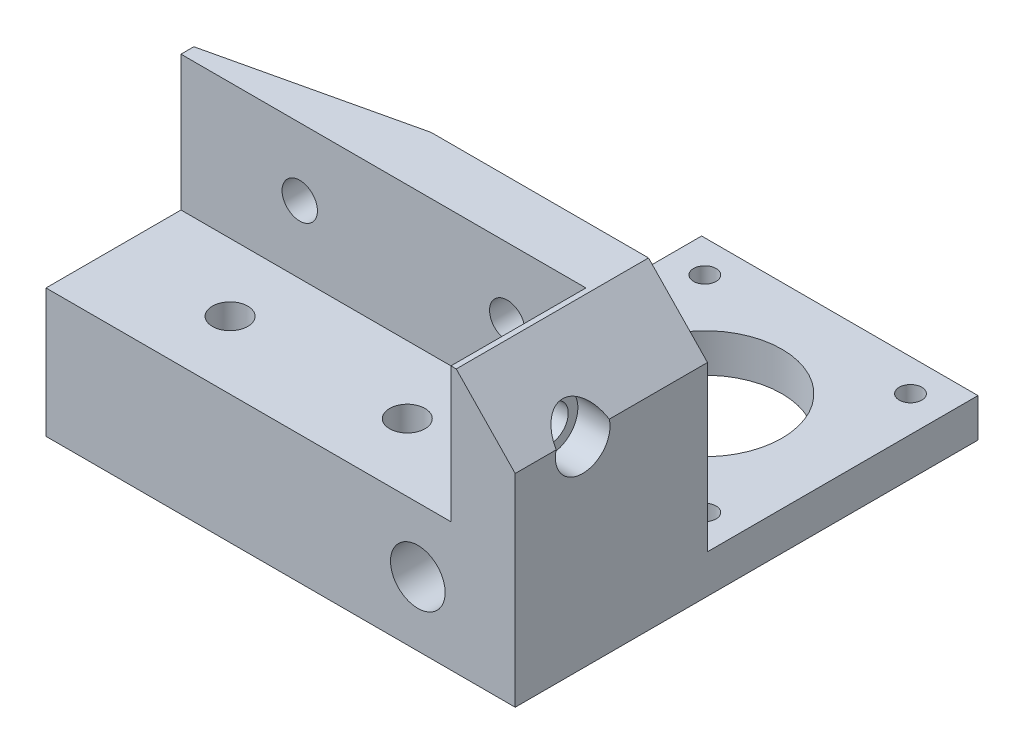
ISO-10303-21;
HEADER;
FILE_DESCRIPTION(('STEP AP214'),'2;1');
FILE_NAME('part.step','',(''),(''),'','','');
FILE_SCHEMA(('AUTOMOTIVE_DESIGN { 1 0 10303 214 1 1 1 1 }'));
ENDSEC;
DATA;
#1=APPLICATION_CONTEXT('core data for automotive mechanical design processes');
#2=APPLICATION_PROTOCOL_DEFINITION('international standard','automotive_design',2000,#1);
#3=PRODUCT_CONTEXT('',#1,'mechanical');
#4=PRODUCT('Part','Part','',(#3));
#5=PRODUCT_RELATED_PRODUCT_CATEGORY('part','',(#4));
#6=PRODUCT_DEFINITION_FORMATION('','',#4);
#7=PRODUCT_DEFINITION_CONTEXT('part definition',#1,'design');
#8=PRODUCT_DEFINITION('design','',#6,#7);
#9=PRODUCT_DEFINITION_SHAPE('','',#8);
#10=(LENGTH_UNIT() NAMED_UNIT(*) SI_UNIT(.MILLI.,.METRE.));
#11=(NAMED_UNIT(*) PLANE_ANGLE_UNIT() SI_UNIT($,.RADIAN.));
#12=(NAMED_UNIT(*) SI_UNIT($,.STERADIAN.) SOLID_ANGLE_UNIT());
#13=UNCERTAINTY_MEASURE_WITH_UNIT(LENGTH_MEASURE(1.E-05),#10,'distance_accuracy_value','');
#14=(GEOMETRIC_REPRESENTATION_CONTEXT(3) GLOBAL_UNCERTAINTY_ASSIGNED_CONTEXT((#13)) GLOBAL_UNIT_ASSIGNED_CONTEXT((#10,
#11,#12)) REPRESENTATION_CONTEXT('',''));
#15=CARTESIAN_POINT('',(0.,0.,0.));
#16=DIRECTION('',(0.,0.,1.));
#17=DIRECTION('',(1.,0.,0.));
#18=AXIS2_PLACEMENT_3D('',#15,#16,#17);
#19=CARTESIAN_POINT('',(106.971365542953,0.,32.5250375640439));
#20=DIRECTION('',(0.,1.,0.));
#21=DIRECTION('',(0.,0.,1.));
#22=AXIS2_PLACEMENT_3D('',#19,#20,#21);
#23=CYLINDRICAL_SURFACE('',#22,2.75);
#24=CARTESIAN_POINT('',(106.971365542953,20.,32.5250375640439));
#25=DIRECTION('',(0.,-1.,0.));
#26=DIRECTION('',(0.,0.,1.));
#27=AXIS2_PLACEMENT_3D('',#24,#25,#26);
#28=CIRCLE('',#27,2.75);
#29=CARTESIAN_POINT('',(106.971365542953,20.,35.2750375640439));
#30=VERTEX_POINT('',#29);
#31=EDGE_CURVE('E225',#30,#30,#28,.T.);
#32=ORIENTED_EDGE('',*,*,#31,.F.);
#33=EDGE_LOOP('',(#32));
#34=FACE_BOUND('',#33,.T.);
#35=CARTESIAN_POINT('',(106.971365542953,15.5,32.5250375640439));
#36=DIRECTION('',(0.,1.,0.));
#37=DIRECTION('',(0.,0.,-1.));
#38=AXIS2_PLACEMENT_3D('',#35,#36,#37);
#39=CIRCLE('',#38,2.75);
#40=CARTESIAN_POINT('',(106.971365542953,15.5,29.7750375640439));
#41=VERTEX_POINT('',#40);
#42=EDGE_CURVE('E37',#41,#41,#39,.F.);
#43=ORIENTED_EDGE('',*,*,#42,.T.);
#44=EDGE_LOOP('',(#43));
#45=FACE_BOUND('',#44,.T.);
#46=ADVANCED_FACE('F33',(#34,#45),#23,.F.);
#47=CARTESIAN_POINT('',(79.3993980804299,0.,32.5250375640439));
#48=DIRECTION('',(0.,1.,0.));
#49=DIRECTION('',(0.,0.,1.));
#50=AXIS2_PLACEMENT_3D('',#47,#48,#49);
#51=CYLINDRICAL_SURFACE('',#50,2.75);
#52=CARTESIAN_POINT('',(79.3993980804299,20.,32.5250375640439));
#53=DIRECTION('',(0.,-1.,0.));
#54=DIRECTION('',(0.,0.,1.));
#55=AXIS2_PLACEMENT_3D('',#52,#53,#54);
#56=CIRCLE('',#55,2.75);
#57=CARTESIAN_POINT('',(79.3993980804299,20.,35.2750375640439));
#58=VERTEX_POINT('',#57);
#59=EDGE_CURVE('E220',#58,#58,#56,.T.);
#60=ORIENTED_EDGE('',*,*,#59,.F.);
#61=EDGE_LOOP('',(#60));
#62=FACE_BOUND('',#61,.T.);
#63=CARTESIAN_POINT('',(79.3993980804299,15.5,32.5250375640439));
#64=DIRECTION('',(0.,1.,0.));
#65=DIRECTION('',(0.,0.,-1.));
#66=AXIS2_PLACEMENT_3D('',#63,#64,#65);
#67=CIRCLE('',#66,2.75);
#68=CARTESIAN_POINT('',(79.3993980804299,15.5,29.7750375640439));
#69=VERTEX_POINT('',#68);
#70=EDGE_CURVE('E218',#69,#69,#67,.F.);
#71=ORIENTED_EDGE('',*,*,#70,.T.);
#72=EDGE_LOOP('',(#71));
#73=FACE_BOUND('',#72,.T.);
#74=ADVANCED_FACE('F267',(#62,#73),#51,.F.);
#75=CARTESIAN_POINT('',(134.262900047815,6.,-28.9749624359561));
#76=DIRECTION('',(-1.,0.,0.));
#77=DIRECTION('',(0.,0.,-1.));
#78=AXIS2_PLACEMENT_3D('',#75,#76,#77);
#79=PLANE('',#78);
#80=CARTESIAN_POINT('',(134.262900047816,30.5,32.5250375640439));
#81=DIRECTION('',(1.,0.,0.));
#82=DIRECTION('',(0.,0.,-1.));
#83=AXIS2_PLACEMENT_3D('',#80,#81,#82);
#84=CIRCLE('',#83,4.25);
#85=CARTESIAN_POINT('',(134.262900047815,31.5,36.6557154745085));
#86=VERTEX_POINT('',#85);
#87=CARTESIAN_POINT('',(134.262900047816,31.4999999999999,28.3943596535793));
#88=VERTEX_POINT('',#87);
#89=EDGE_CURVE('E131',#86,#88,#84,.T.);
#90=ORIENTED_EDGE('',*,*,#89,.F.);
#91=DIRECTION('',(0.,0.,-1.));
#92=VECTOR('',#91,1.);
#93=CARTESIAN_POINT('',(134.262900047815,31.5,13.1094021442886));
#94=LINE('',#93,#92);
#95=CARTESIAN_POINT('',(134.262900047815,31.5,43.0250375640439));
#96=VERTEX_POINT('',#95);
#97=EDGE_CURVE('E127',#96,#86,#94,.T.);
#98=ORIENTED_EDGE('',*,*,#97,.F.);
#99=DIRECTION('',(0.,-1.,0.));
#100=VECTOR('',#99,1.);
#101=CARTESIAN_POINT('',(134.262900047815,6.,43.0250375640439));
#102=LINE('',#101,#100);
#103=CARTESIAN_POINT('',(134.262900047815,0.,43.0250375640439));
#104=VERTEX_POINT('',#103);
#105=EDGE_CURVE('E326',#96,#104,#102,.T.);
#106=ORIENTED_EDGE('',*,*,#105,.T.);
#107=DIRECTION('',(0.,0.,1.));
#108=VECTOR('',#107,1.);
#109=CARTESIAN_POINT('',(134.262900047815,0.,-28.9749624359561));
#110=LINE('',#109,#108);
#111=CARTESIAN_POINT('',(134.262900047815,0.,-28.9749624359561));
#112=VERTEX_POINT('',#111);
#113=EDGE_CURVE('E343',#112,#104,#110,.T.);
#114=ORIENTED_EDGE('',*,*,#113,.F.);
#115=DIRECTION('',(0.,-1.,0.));
#116=VECTOR('',#115,1.);
#117=CARTESIAN_POINT('',(134.262900047815,6.,-28.9749624359561));
#118=LINE('',#117,#116);
#119=CARTESIAN_POINT('',(134.262900047815,6.,-28.9749624359561));
#120=VERTEX_POINT('',#119);
#121=EDGE_CURVE('E366',#120,#112,#118,.T.);
#122=ORIENTED_EDGE('',*,*,#121,.F.);
#123=DIRECTION('',(0.,0.,1.));
#124=VECTOR('',#123,1.);
#125=CARTESIAN_POINT('',(134.262900047815,6.,-28.9749624359561));
#126=LINE('',#125,#124);
#127=CARTESIAN_POINT('',(134.262900047815,6.,13.1094021442886));
#128=VERTEX_POINT('',#127);
#129=EDGE_CURVE('E192',#120,#128,#126,.T.);
#130=ORIENTED_EDGE('',*,*,#129,.T.);
#131=DIRECTION('',(0.,-1.,0.));
#132=VECTOR('',#131,1.);
#133=CARTESIAN_POINT('',(134.262900047815,41.,13.1094021442886));
#134=LINE('',#133,#132);
#135=CARTESIAN_POINT('',(134.262900047815,31.5,13.1094021442886));
#136=VERTEX_POINT('',#135);
#137=EDGE_CURVE('E133',#136,#128,#134,.T.);
#138=ORIENTED_EDGE('',*,*,#137,.F.);
#139=DIRECTION('',(0.,0.,-1.));
#140=VECTOR('',#139,1.);
#141=CARTESIAN_POINT('',(134.262900047815,31.5,13.1094021442886));
#142=LINE('',#141,#140);
#143=EDGE_CURVE('E124',#88,#136,#142,.T.);
#144=ORIENTED_EDGE('',*,*,#143,.F.);
#145=EDGE_LOOP('',(#90,#98,#106,#114,#122,#130,#138,#144));
#146=FACE_BOUND('',#145,.T.);
#147=ADVANCED_FACE('F130',(#146),#79,.F.);
#148=CARTESIAN_POINT('',(125.088856687148,41.,0.));
#149=DIRECTION('',(0.719339800338652,0.694658370458996,0.));
#150=DIRECTION('',(0.,0.,-1.));
#151=AXIS2_PLACEMENT_3D('',#148,#149,#150);
#152=PLANE('',#151);
#153=ORIENTED_EDGE('',*,*,#143,.T.);
#154=DIRECTION('',(-0.694658370458996,0.719339800338652,0.));
#155=VECTOR('',#154,1.);
#156=CARTESIAN_POINT('',(125.088856687148,41.,13.1094021442886));
#157=LINE('',#156,#155);
#158=CARTESIAN_POINT('',(125.088856687148,41.,13.1094021442886));
#159=VERTEX_POINT('',#158);
#160=EDGE_CURVE('E42',#136,#159,#157,.T.);
#161=ORIENTED_EDGE('',*,*,#160,.T.);
#162=DIRECTION('',(0.,0.,1.));
#163=VECTOR('',#162,1.);
#164=CARTESIAN_POINT('',(125.088856687148,41.,43.0250375640439));
#165=LINE('',#164,#163);
#166=CARTESIAN_POINT('',(125.088856687148,41.,43.0250375640439));
#167=VERTEX_POINT('',#166);
#168=EDGE_CURVE('E197',#159,#167,#165,.T.);
#169=ORIENTED_EDGE('',*,*,#168,.T.);
#170=DIRECTION('',(0.694658370458996,-0.719339800338652,0.));
#171=VECTOR('',#170,1.);
#172=CARTESIAN_POINT('',(125.088856687148,41.,43.0250375640439));
#173=LINE('',#172,#171);
#174=EDGE_CURVE('E134',#167,#96,#173,.T.);
#175=ORIENTED_EDGE('',*,*,#174,.T.);
#176=ORIENTED_EDGE('',*,*,#97,.T.);
#177=CARTESIAN_POINT('',(135.228588822623,30.5,32.5250375640439));
#178=DIRECTION('',(-0.719339800338652,-0.694658370458996,0.));
#179=DIRECTION('',(0.694658370458996,-0.719339800338652,0.));
#180=AXIS2_PLACEMENT_3D('',#177,#178,#179);
#181=ELLIPSE('',#180,5.90819526182088,4.25);
#182=EDGE_CURVE('E11',#88,#86,#181,.F.);
#183=ORIENTED_EDGE('',*,*,#182,.F.);
#184=EDGE_LOOP('',(#153,#161,#169,#175,#176,#183));
#185=FACE_BOUND('',#184,.T.);
#186=ADVANCED_FACE('F35',(#185),#152,.T.);
#187=CARTESIAN_POINT('',(102.525800095631,6.,0.));
#188=DIRECTION('',(0.,1.,0.));
#189=DIRECTION('',(0.,0.,1.));
#190=AXIS2_PLACEMENT_3D('',#187,#188,#189);
#191=PLANE('',#190);
#192=DIRECTION('',(1.,0.,0.));
#193=VECTOR('',#192,1.);
#194=CARTESIAN_POINT('',(91.2629000478155,6.,13.1094021442886));
#195=LINE('',#194,#193);
#196=CARTESIAN_POINT('',(91.2629000478155,6.,13.1094021442886));
#197=VERTEX_POINT('',#196);
#198=EDGE_CURVE('E169',#197,#128,#195,.T.);
#199=ORIENTED_EDGE('',*,*,#198,.T.);
#200=ORIENTED_EDGE('',*,*,#129,.F.);
#201=DIRECTION('',(1.,0.,0.));
#202=VECTOR('',#201,1.);
#203=CARTESIAN_POINT('',(134.262900047815,6.,-28.9749624359561));
#204=LINE('',#203,#202);
#205=CARTESIAN_POINT('',(91.2629000478155,6.,-28.9749624359561));
#206=VERTEX_POINT('',#205);
#207=EDGE_CURVE('E358',#206,#120,#204,.T.);
#208=ORIENTED_EDGE('',*,*,#207,.F.);
#209=DIRECTION('',(0.,0.,-1.));
#210=VECTOR('',#209,1.);
#211=CARTESIAN_POINT('',(91.2629000478155,6.,-28.9749624359561));
#212=LINE('',#211,#210);
#213=EDGE_CURVE('E372',#197,#206,#212,.T.);
#214=ORIENTED_EDGE('',*,*,#213,.F.);
#215=EDGE_LOOP('',(#199,#200,#208,#214));
#216=FACE_BOUND('',#215,.T.);
#217=CARTESIAN_POINT('',(96.7629000478152,6.,8.02503756404347));
#218=DIRECTION('',(0.,-1.,0.));
#219=DIRECTION('',(0.,0.,1.));
#220=AXIS2_PLACEMENT_3D('',#217,#218,#219);
#221=CIRCLE('',#220,1.75);
#222=CARTESIAN_POINT('',(96.7629000478152,6.,9.77503756404347));
#223=VERTEX_POINT('',#222);
#224=EDGE_CURVE('E686',#223,#223,#221,.T.);
#225=ORIENTED_EDGE('',*,*,#224,.T.);
#226=EDGE_LOOP('',(#225));
#227=FACE_BOUND('',#226,.T.);
#228=CARTESIAN_POINT('',(128.762900047816,6.,-23.9749624359561));
#229=DIRECTION('',(0.,-1.,0.));
#230=DIRECTION('',(0.,0.,1.));
#231=AXIS2_PLACEMENT_3D('',#228,#229,#230);
#232=CIRCLE('',#231,1.75);
#233=CARTESIAN_POINT('',(128.762900047816,6.,-22.2249624359561));
#234=VERTEX_POINT('',#233);
#235=EDGE_CURVE('E663',#234,#234,#232,.T.);
#236=ORIENTED_EDGE('',*,*,#235,.T.);
#237=EDGE_LOOP('',(#236));
#238=FACE_BOUND('',#237,.T.);
#239=CARTESIAN_POINT('',(112.762900047816,6.,-7.97496243595609));
#240=DIRECTION('',(0.,-1.,0.));
#241=DIRECTION('',(0.,0.,1.));
#242=AXIS2_PLACEMENT_3D('',#239,#240,#241);
#243=CIRCLE('',#242,12.);
#244=CARTESIAN_POINT('',(112.762900047816,6.,4.02503756404391));
#245=VERTEX_POINT('',#244);
#246=EDGE_CURVE('E352',#245,#245,#243,.T.);
#247=ORIENTED_EDGE('',*,*,#246,.T.);
#248=EDGE_LOOP('',(#247));
#249=FACE_BOUND('',#248,.T.);
#250=CARTESIAN_POINT('',(96.7629000478155,6.,-23.9749624359565));
#251=DIRECTION('',(0.,-1.,0.));
#252=DIRECTION('',(0.,0.,1.));
#253=AXIS2_PLACEMENT_3D('',#250,#251,#252);
#254=CIRCLE('',#253,1.75);
#255=CARTESIAN_POINT('',(96.7629000478155,6.,-22.2249624359565));
#256=VERTEX_POINT('',#255);
#257=EDGE_CURVE('E664',#256,#256,#254,.T.);
#258=ORIENTED_EDGE('',*,*,#257,.T.);
#259=EDGE_LOOP('',(#258));
#260=FACE_BOUND('',#259,.T.);
#261=CARTESIAN_POINT('',(128.762900047815,6.,8.02503756404391));
#262=DIRECTION('',(0.,-1.,0.));
#263=DIRECTION('',(0.,0.,1.));
#264=AXIS2_PLACEMENT_3D('',#261,#262,#263);
#265=CIRCLE('',#264,1.75);
#266=CARTESIAN_POINT('',(128.762900047815,6.,9.77503756404391));
#267=VERTEX_POINT('',#266);
#268=EDGE_CURVE('E680',#267,#267,#265,.T.);
#269=ORIENTED_EDGE('',*,*,#268,.T.);
#270=EDGE_LOOP('',(#269));
#271=FACE_BOUND('',#270,.T.);
#272=ADVANCED_FACE('F415',(#216,#227,#238,#249,#260,#271),#191,.T.);
#273=CARTESIAN_POINT('',(102.525800095631,0.,0.));
#274=DIRECTION('',(0.,1.,0.));
#275=DIRECTION('',(0.,0.,1.));
#276=AXIS2_PLACEMENT_3D('',#273,#274,#275);
#277=PLANE('',#276);
#278=CARTESIAN_POINT('',(106.971365542953,0.,32.5250375640439));
#279=DIRECTION('',(0.,1.,0.));
#280=DIRECTION('',(0.,0.,-1.));
#281=AXIS2_PLACEMENT_3D('',#278,#279,#280);
#282=CIRCLE('',#281,4.25);
#283=CARTESIAN_POINT('',(106.971365542953,0.,28.2750375640439));
#284=VERTEX_POINT('',#283);
#285=EDGE_CURVE('E235',#284,#284,#282,.T.);
#286=ORIENTED_EDGE('',*,*,#285,.T.);
#287=EDGE_LOOP('',(#286));
#288=FACE_BOUND('',#287,.T.);
#289=CARTESIAN_POINT('',(79.3993980804299,0.,32.5250375640439));
#290=DIRECTION('',(0.,1.,0.));
#291=DIRECTION('',(0.,0.,-1.));
#292=AXIS2_PLACEMENT_3D('',#289,#290,#291);
#293=CIRCLE('',#292,4.25);
#294=CARTESIAN_POINT('',(79.3993980804299,0.,28.2750375640439));
#295=VERTEX_POINT('',#294);
#296=EDGE_CURVE('E228',#295,#295,#293,.T.);
#297=ORIENTED_EDGE('',*,*,#296,.T.);
#298=EDGE_LOOP('',(#297));
#299=FACE_BOUND('',#298,.T.);
#300=CARTESIAN_POINT('',(96.7629000478152,0.,8.02503756404347));
#301=DIRECTION('',(0.,-1.,0.));
#302=DIRECTION('',(0.,0.,1.));
#303=AXIS2_PLACEMENT_3D('',#300,#301,#302);
#304=CIRCLE('',#303,1.75);
#305=CARTESIAN_POINT('',(96.7629000478152,0.,9.77503756404347));
#306=VERTEX_POINT('',#305);
#307=EDGE_CURVE('E658',#306,#306,#304,.T.);
#308=ORIENTED_EDGE('',*,*,#307,.F.);
#309=EDGE_LOOP('',(#308));
#310=FACE_BOUND('',#309,.T.);
#311=CARTESIAN_POINT('',(128.762900047816,0.,-23.9749624359561));
#312=DIRECTION('',(0.,-1.,0.));
#313=DIRECTION('',(0.,0.,1.));
#314=AXIS2_PLACEMENT_3D('',#311,#312,#313);
#315=CIRCLE('',#314,1.75);
#316=CARTESIAN_POINT('',(128.762900047816,0.,-22.2249624359561));
#317=VERTEX_POINT('',#316);
#318=EDGE_CURVE('E661',#317,#317,#315,.T.);
#319=ORIENTED_EDGE('',*,*,#318,.F.);
#320=EDGE_LOOP('',(#319));
#321=FACE_BOUND('',#320,.T.);
#322=ORIENTED_EDGE('',*,*,#113,.T.);
#323=DIRECTION('',(-1.,0.,0.));
#324=VECTOR('',#323,1.);
#325=CARTESIAN_POINT('',(134.262900047815,0.,43.0250375640439));
#326=LINE('',#325,#324);
#327=CARTESIAN_POINT('',(61.2629000478155,0.,43.0250375640439));
#328=VERTEX_POINT('',#327);
#329=EDGE_CURVE('E339',#104,#328,#326,.T.);
#330=ORIENTED_EDGE('',*,*,#329,.T.);
#331=DIRECTION('',(0.,0.,-1.));
#332=VECTOR('',#331,1.);
#333=CARTESIAN_POINT('',(61.2629000478155,0.,43.0250375640439));
#334=LINE('',#333,#332);
#335=CARTESIAN_POINT('',(61.2629000478155,0.,20.0250375640439));
#336=VERTEX_POINT('',#335);
#337=EDGE_CURVE('E342',#328,#336,#334,.T.);
#338=ORIENTED_EDGE('',*,*,#337,.T.);
#339=DIRECTION('',(0.974444127815744,0.,-0.224630010829839));
#340=VECTOR('',#339,1.);
#341=CARTESIAN_POINT('',(61.2629000478155,0.,20.0250375640439));
#342=LINE('',#341,#340);
#343=CARTESIAN_POINT('',(91.2629000478155,0.,13.1094021442886));
#344=VERTEX_POINT('',#343);
#345=EDGE_CURVE('E320',#336,#344,#342,.T.);
#346=ORIENTED_EDGE('',*,*,#345,.T.);
#347=DIRECTION('',(0.,0.,-1.));
#348=VECTOR('',#347,1.);
#349=CARTESIAN_POINT('',(91.2629000478155,0.,-28.9749624359561));
#350=LINE('',#349,#348);
#351=CARTESIAN_POINT('',(91.2629000478155,0.,-28.9749624359561));
#352=VERTEX_POINT('',#351);
#353=EDGE_CURVE('E363',#344,#352,#350,.T.);
#354=ORIENTED_EDGE('',*,*,#353,.T.);
#355=DIRECTION('',(1.,0.,0.));
#356=VECTOR('',#355,1.);
#357=CARTESIAN_POINT('',(134.262900047815,0.,-28.9749624359561));
#358=LINE('',#357,#356);
#359=EDGE_CURVE('E349',#352,#112,#358,.T.);
#360=ORIENTED_EDGE('',*,*,#359,.T.);
#361=EDGE_LOOP('',(#322,#330,#338,#346,#354,#360));
#362=FACE_BOUND('',#361,.T.);
#363=CARTESIAN_POINT('',(112.762900047816,0.,-7.97496243595609));
#364=DIRECTION('',(0.,-1.,0.));
#365=DIRECTION('',(0.,0.,1.));
#366=AXIS2_PLACEMENT_3D('',#363,#364,#365);
#367=CIRCLE('',#366,12.);
#368=CARTESIAN_POINT('',(112.762900047816,0.,4.02503756404391));
#369=VERTEX_POINT('',#368);
#370=EDGE_CURVE('E355',#369,#369,#367,.T.);
#371=ORIENTED_EDGE('',*,*,#370,.F.);
#372=EDGE_LOOP('',(#371));
#373=FACE_BOUND('',#372,.T.);
#374=CARTESIAN_POINT('',(96.7629000478155,0.,-23.9749624359565));
#375=DIRECTION('',(0.,-1.,0.));
#376=DIRECTION('',(0.,0.,1.));
#377=AXIS2_PLACEMENT_3D('',#374,#375,#376);
#378=CIRCLE('',#377,1.75);
#379=CARTESIAN_POINT('',(96.7629000478155,0.,-22.2249624359565));
#380=VERTEX_POINT('',#379);
#381=EDGE_CURVE('E669',#380,#380,#378,.T.);
#382=ORIENTED_EDGE('',*,*,#381,.F.);
#383=EDGE_LOOP('',(#382));
#384=FACE_BOUND('',#383,.T.);
#385=CARTESIAN_POINT('',(128.762900047815,0.,8.02503756404391));
#386=DIRECTION('',(0.,-1.,0.));
#387=DIRECTION('',(0.,0.,1.));
#388=AXIS2_PLACEMENT_3D('',#385,#386,#387);
#389=CIRCLE('',#388,1.75);
#390=CARTESIAN_POINT('',(128.762900047815,0.,9.77503756404391));
#391=VERTEX_POINT('',#390);
#392=EDGE_CURVE('E678',#391,#391,#389,.T.);
#393=ORIENTED_EDGE('',*,*,#392,.F.);
#394=EDGE_LOOP('',(#393));
#395=FACE_BOUND('',#394,.T.);
#396=ADVANCED_FACE('F345',(#288,#299,#310,#321,#362,#373,#384,#395),#277,.F.);
#397=CARTESIAN_POINT('',(134.262900047815,6.,43.0250375640439));
#398=DIRECTION('',(0.,0.,-1.));
#399=DIRECTION('',(1.,0.,0.));
#400=AXIS2_PLACEMENT_3D('',#397,#398,#399);
#401=PLANE('',#400);
#402=CARTESIAN_POINT('',(119.112900047816,10.,43.0250375640439));
#403=DIRECTION('',(0.,0.,-1.));
#404=DIRECTION('',(-1.,0.,0.));
#405=AXIS2_PLACEMENT_3D('',#402,#403,#404);
#406=CIRCLE('',#405,4.25);
#407=CARTESIAN_POINT('',(114.862900047816,10.,43.0250375640439));
#408=VERTEX_POINT('',#407);
#409=EDGE_CURVE('E639',#408,#408,#406,.T.);
#410=ORIENTED_EDGE('',*,*,#409,.T.);
#411=EDGE_LOOP('',(#410));
#412=FACE_BOUND('',#411,.T.);
#413=DIRECTION('',(-1.,0.,0.));
#414=VECTOR('',#413,1.);
#415=CARTESIAN_POINT('',(134.262900047815,41.,43.0250375640439));
#416=LINE('',#415,#414);
#417=CARTESIAN_POINT('',(124.262900047816,41.,43.0250375640439));
#418=VERTEX_POINT('',#417);
#419=EDGE_CURVE('E182',#167,#418,#416,.T.);
#420=ORIENTED_EDGE('',*,*,#419,.T.);
#421=DIRECTION('',(0.,1.,0.));
#422=VECTOR('',#421,1.);
#423=CARTESIAN_POINT('',(124.262900047816,20.,43.0250375640439));
#424=LINE('',#423,#422);
#425=CARTESIAN_POINT('',(124.262900047816,20.,43.0250375640439));
#426=VERTEX_POINT('',#425);
#427=EDGE_CURVE('E166',#426,#418,#424,.T.);
#428=ORIENTED_EDGE('',*,*,#427,.F.);
#429=DIRECTION('',(-1.,0.,0.));
#430=VECTOR('',#429,1.);
#431=CARTESIAN_POINT('',(61.2629000478155,20.,43.0250375640439));
#432=LINE('',#431,#430);
#433=CARTESIAN_POINT('',(61.2629000478155,20.,43.0250375640439));
#434=VERTEX_POINT('',#433);
#435=EDGE_CURVE('E159',#426,#434,#432,.T.);
#436=ORIENTED_EDGE('',*,*,#435,.T.);
#437=DIRECTION('',(0.,-1.,0.));
#438=VECTOR('',#437,1.);
#439=CARTESIAN_POINT('',(61.2629000478155,6.,43.0250375640439));
#440=LINE('',#439,#438);
#441=EDGE_CURVE('E323',#434,#328,#440,.T.);
#442=ORIENTED_EDGE('',*,*,#441,.T.);
#443=ORIENTED_EDGE('',*,*,#329,.F.);
#444=ORIENTED_EDGE('',*,*,#105,.F.);
#445=ORIENTED_EDGE('',*,*,#174,.F.);
#446=EDGE_LOOP('',(#420,#428,#436,#442,#443,#444,#445));
#447=FACE_BOUND('',#446,.T.);
#448=ADVANCED_FACE('F337',(#412,#447),#401,.F.);
#449=CARTESIAN_POINT('',(61.2629000478155,6.,43.0250375640439));
#450=DIRECTION('',(1.,0.,0.));
#451=DIRECTION('',(0.,0.,1.));
#452=AXIS2_PLACEMENT_3D('',#449,#450,#451);
#453=PLANE('',#452);
#454=DIRECTION('',(0.,0.,-1.));
#455=VECTOR('',#454,1.);
#456=CARTESIAN_POINT('',(61.2629000478155,41.,43.0250375640439));
#457=LINE('',#456,#455);
#458=CARTESIAN_POINT('',(61.2629000478155,41.,22.0250375640439));
#459=VERTEX_POINT('',#458);
#460=CARTESIAN_POINT('',(61.2629000478155,41.,20.0250375640439));
#461=VERTEX_POINT('',#460);
#462=EDGE_CURVE('E174',#459,#461,#457,.T.);
#463=ORIENTED_EDGE('',*,*,#462,.T.);
#464=DIRECTION('',(0.,-1.,0.));
#465=VECTOR('',#464,1.);
#466=CARTESIAN_POINT('',(61.2629000478155,6.,20.0250375640439));
#467=LINE('',#466,#465);
#468=EDGE_CURVE('E317',#461,#336,#467,.T.);
#469=ORIENTED_EDGE('',*,*,#468,.T.);
#470=ORIENTED_EDGE('',*,*,#337,.F.);
#471=ORIENTED_EDGE('',*,*,#441,.F.);
#472=DIRECTION('',(0.,0.,-1.));
#473=VECTOR('',#472,1.);
#474=CARTESIAN_POINT('',(61.2629000478155,20.,43.0250375640439));
#475=LINE('',#474,#473);
#476=CARTESIAN_POINT('',(61.2629000478155,20.,22.0250375640439));
#477=VERTEX_POINT('',#476);
#478=EDGE_CURVE('E151',#434,#477,#475,.T.);
#479=ORIENTED_EDGE('',*,*,#478,.T.);
#480=DIRECTION('',(0.,1.,0.));
#481=VECTOR('',#480,1.);
#482=CARTESIAN_POINT('',(61.2629000478155,20.,22.0250375640439));
#483=LINE('',#482,#481);
#484=EDGE_CURVE('E162',#477,#459,#483,.T.);
#485=ORIENTED_EDGE('',*,*,#484,.T.);
#486=EDGE_LOOP('',(#463,#469,#470,#471,#479,#485));
#487=FACE_BOUND('',#486,.T.);
#488=ADVANCED_FACE('F308',(#487),#453,.F.);
#489=CARTESIAN_POINT('',(61.2629000478155,6.,20.0250375640439));
#490=DIRECTION('',(0.224630010829839,0.,0.974444127815744));
#491=DIRECTION('',(-0.974444127815744,0.,0.224630010829839));
#492=AXIS2_PLACEMENT_3D('',#489,#490,#491);
#493=PLANE('',#492);
#494=CARTESIAN_POINT('',(79.740074841326,30.5,15.7656574154102));
#495=DIRECTION('',(-0.224630010829839,0.,-0.974444127815744));
#496=DIRECTION('',(-0.974444127815744,0.,0.224630010829839));
#497=AXIS2_PLACEMENT_3D('',#494,#495,#496);
#498=ELLIPSE('',#497,4.36146093827519,4.25);
#499=CARTESIAN_POINT('',(75.490074841326,30.5,16.7453724332089));
#500=VERTEX_POINT('',#499);
#501=EDGE_CURVE('E215',#500,#500,#498,.T.);
#502=ORIENTED_EDGE('',*,*,#501,.F.);
#503=EDGE_LOOP('',(#502));
#504=FACE_BOUND('',#503,.T.);
#505=ORIENTED_EDGE('',*,*,#345,.F.);
#506=ORIENTED_EDGE('',*,*,#468,.F.);
#507=DIRECTION('',(0.974444127815744,0.,-0.224630010829839));
#508=VECTOR('',#507,1.);
#509=CARTESIAN_POINT('',(61.2629000478155,41.,20.0250375640439));
#510=LINE('',#509,#508);
#511=CARTESIAN_POINT('',(91.2629000478155,41.,13.1094021442886));
#512=VERTEX_POINT('',#511);
#513=EDGE_CURVE('E177',#461,#512,#510,.T.);
#514=ORIENTED_EDGE('',*,*,#513,.T.);
#515=DIRECTION('',(0.,-1.,0.));
#516=VECTOR('',#515,1.);
#517=CARTESIAN_POINT('',(91.2629000478155,41.,13.1094021442886));
#518=LINE('',#517,#516);
#519=EDGE_CURVE('E187',#512,#197,#518,.T.);
#520=ORIENTED_EDGE('',*,*,#519,.T.);
#521=DIRECTION('',(0.,-1.,0.));
#522=VECTOR('',#521,1.);
#523=CARTESIAN_POINT('',(91.2629000478155,6.,13.1094021442886));
#524=LINE('',#523,#522);
#525=EDGE_CURVE('E324',#197,#344,#524,.T.);
#526=ORIENTED_EDGE('',*,*,#525,.T.);
#527=EDGE_LOOP('',(#505,#506,#514,#520,#526));
#528=FACE_BOUND('',#527,.T.);
#529=ADVANCED_FACE('F318',(#504,#528),#493,.F.);
#530=CARTESIAN_POINT('',(91.2629000478155,6.,-28.9749624359561));
#531=DIRECTION('',(1.,0.,0.));
#532=DIRECTION('',(0.,0.,1.));
#533=AXIS2_PLACEMENT_3D('',#530,#531,#532);
#534=PLANE('',#533);
#535=ORIENTED_EDGE('',*,*,#353,.F.);
#536=ORIENTED_EDGE('',*,*,#525,.F.);
#537=ORIENTED_EDGE('',*,*,#213,.T.);
#538=DIRECTION('',(0.,-1.,0.));
#539=VECTOR('',#538,1.);
#540=CARTESIAN_POINT('',(91.2629000478155,6.,-28.9749624359561));
#541=LINE('',#540,#539);
#542=EDGE_CURVE('E328',#206,#352,#541,.T.);
#543=ORIENTED_EDGE('',*,*,#542,.T.);
#544=EDGE_LOOP('',(#535,#536,#537,#543));
#545=FACE_BOUND('',#544,.T.);
#546=ADVANCED_FACE('F370',(#545),#534,.F.);
#547=CARTESIAN_POINT('',(134.262900047815,6.,-28.9749624359561));
#548=DIRECTION('',(0.,0.,1.));
#549=DIRECTION('',(-1.,0.,0.));
#550=AXIS2_PLACEMENT_3D('',#547,#548,#549);
#551=PLANE('',#550);
#552=ORIENTED_EDGE('',*,*,#359,.F.);
#553=ORIENTED_EDGE('',*,*,#542,.F.);
#554=ORIENTED_EDGE('',*,*,#207,.T.);
#555=ORIENTED_EDGE('',*,*,#121,.T.);
#556=EDGE_LOOP('',(#552,#553,#554,#555));
#557=FACE_BOUND('',#556,.T.);
#558=ADVANCED_FACE('F375',(#557),#551,.F.);
#559=CARTESIAN_POINT('',(112.762900047816,6.,-7.97496243595609));
#560=DIRECTION('',(0.,-1.,0.));
#561=DIRECTION('',(0.,0.,-1.));
#562=AXIS2_PLACEMENT_3D('',#559,#560,#561);
#563=CYLINDRICAL_SURFACE('',#562,12.);
#564=ORIENTED_EDGE('',*,*,#246,.F.);
#565=EDGE_LOOP('',(#564));
#566=FACE_BOUND('',#565,.T.);
#567=ORIENTED_EDGE('',*,*,#370,.T.);
#568=EDGE_LOOP('',(#567));
#569=FACE_BOUND('',#568,.T.);
#570=ADVANCED_FACE('F410',(#566,#569),#563,.F.);
#571=CARTESIAN_POINT('',(128.762900047816,6.,-23.9749624359561));
#572=DIRECTION('',(0.,-1.,0.));
#573=DIRECTION('',(0.,0.,-1.));
#574=AXIS2_PLACEMENT_3D('',#571,#572,#573);
#575=CYLINDRICAL_SURFACE('',#574,1.75);
#576=ORIENTED_EDGE('',*,*,#235,.F.);
#577=EDGE_LOOP('',(#576));
#578=FACE_BOUND('',#577,.T.);
#579=ORIENTED_EDGE('',*,*,#318,.T.);
#580=EDGE_LOOP('',(#579));
#581=FACE_BOUND('',#580,.T.);
#582=ADVANCED_FACE('F406',(#578,#581),#575,.F.);
#583=CARTESIAN_POINT('',(96.7629000478155,6.,-23.9749624359565));
#584=DIRECTION('',(0.,-1.,0.));
#585=DIRECTION('',(0.,0.,-1.));
#586=AXIS2_PLACEMENT_3D('',#583,#584,#585);
#587=CYLINDRICAL_SURFACE('',#586,1.75);
#588=ORIENTED_EDGE('',*,*,#257,.F.);
#589=EDGE_LOOP('',(#588));
#590=FACE_BOUND('',#589,.T.);
#591=ORIENTED_EDGE('',*,*,#381,.T.);
#592=EDGE_LOOP('',(#591));
#593=FACE_BOUND('',#592,.T.);
#594=ADVANCED_FACE('F402',(#590,#593),#587,.F.);
#595=CARTESIAN_POINT('',(96.7629000478152,6.,8.02503756404347));
#596=DIRECTION('',(0.,-1.,0.));
#597=DIRECTION('',(0.,0.,-1.));
#598=AXIS2_PLACEMENT_3D('',#595,#596,#597);
#599=CYLINDRICAL_SURFACE('',#598,1.75);
#600=ORIENTED_EDGE('',*,*,#224,.F.);
#601=EDGE_LOOP('',(#600));
#602=FACE_BOUND('',#601,.T.);
#603=ORIENTED_EDGE('',*,*,#307,.T.);
#604=EDGE_LOOP('',(#603));
#605=FACE_BOUND('',#604,.T.);
#606=ADVANCED_FACE('F398',(#602,#605),#599,.F.);
#607=CARTESIAN_POINT('',(128.762900047815,6.,8.02503756404391));
#608=DIRECTION('',(0.,-1.,0.));
#609=DIRECTION('',(0.,0.,-1.));
#610=AXIS2_PLACEMENT_3D('',#607,#608,#609);
#611=CYLINDRICAL_SURFACE('',#610,1.75);
#612=ORIENTED_EDGE('',*,*,#268,.F.);
#613=EDGE_LOOP('',(#612));
#614=FACE_BOUND('',#613,.T.);
#615=ORIENTED_EDGE('',*,*,#392,.T.);
#616=EDGE_LOOP('',(#615));
#617=FACE_BOUND('',#616,.T.);
#618=ADVANCED_FACE('F394',(#614,#617),#611,.F.);
#619=CARTESIAN_POINT('',(91.2629000478155,41.,13.1094021442886));
#620=DIRECTION('',(0.,0.,1.));
#621=DIRECTION('',(-1.,0.,0.));
#622=AXIS2_PLACEMENT_3D('',#619,#620,#621);
#623=PLANE('',#622);
#624=CARTESIAN_POINT('',(112.021509071937,30.5,13.1094021442886));
#625=DIRECTION('',(0.,0.,-1.));
#626=DIRECTION('',(-1.,0.,0.));
#627=AXIS2_PLACEMENT_3D('',#624,#625,#626);
#628=CIRCLE('',#627,4.25);
#629=CARTESIAN_POINT('',(107.771509071937,30.5,13.1094021442886));
#630=VERTEX_POINT('',#629);
#631=EDGE_CURVE('E208',#630,#630,#628,.T.);
#632=ORIENTED_EDGE('',*,*,#631,.F.);
#633=EDGE_LOOP('',(#632));
#634=FACE_BOUND('',#633,.T.);
#635=ORIENTED_EDGE('',*,*,#137,.T.);
#636=ORIENTED_EDGE('',*,*,#198,.F.);
#637=ORIENTED_EDGE('',*,*,#519,.F.);
#638=DIRECTION('',(1.,0.,0.));
#639=VECTOR('',#638,1.);
#640=CARTESIAN_POINT('',(91.2629000478155,41.,13.1094021442886));
#641=LINE('',#640,#639);
#642=EDGE_CURVE('E180',#512,#159,#641,.T.);
#643=ORIENTED_EDGE('',*,*,#642,.T.);
#644=ORIENTED_EDGE('',*,*,#160,.F.);
#645=EDGE_LOOP('',(#635,#636,#637,#643,#644));
#646=FACE_BOUND('',#645,.T.);
#647=ADVANCED_FACE('F387',(#634,#646),#623,.F.);
#648=CARTESIAN_POINT('',(102.525800095631,41.,0.));
#649=DIRECTION('',(0.,1.,0.));
#650=DIRECTION('',(0.,0.,1.));
#651=AXIS2_PLACEMENT_3D('',#648,#649,#650);
#652=PLANE('',#651);
#653=ORIENTED_EDGE('',*,*,#642,.F.);
#654=ORIENTED_EDGE('',*,*,#513,.F.);
#655=ORIENTED_EDGE('',*,*,#462,.F.);
#656=DIRECTION('',(1.,0.,0.));
#657=VECTOR('',#656,1.);
#658=CARTESIAN_POINT('',(61.2629000478155,41.,22.0250375640439));
#659=LINE('',#658,#657);
#660=CARTESIAN_POINT('',(124.262900047816,41.,22.0250375640439));
#661=VERTEX_POINT('',#660);
#662=EDGE_CURVE('E150',#459,#661,#659,.T.);
#663=ORIENTED_EDGE('',*,*,#662,.T.);
#664=DIRECTION('',(0.,0.,1.));
#665=VECTOR('',#664,1.);
#666=CARTESIAN_POINT('',(124.262900047816,41.,43.0250375640439));
#667=LINE('',#666,#665);
#668=EDGE_CURVE('E155',#661,#418,#667,.T.);
#669=ORIENTED_EDGE('',*,*,#668,.T.);
#670=ORIENTED_EDGE('',*,*,#419,.F.);
#671=ORIENTED_EDGE('',*,*,#168,.F.);
#672=EDGE_LOOP('',(#653,#654,#655,#663,#669,#670,#671));
#673=FACE_BOUND('',#672,.T.);
#674=ADVANCED_FACE('F310',(#673),#652,.T.);
#675=CARTESIAN_POINT('',(124.262900047816,20.,43.0250375640439));
#676=DIRECTION('',(1.,0.,0.));
#677=DIRECTION('',(0.,0.,1.));
#678=AXIS2_PLACEMENT_3D('',#675,#676,#677);
#679=PLANE('',#678);
#680=CARTESIAN_POINT('',(124.262900047816,30.5,32.5250375640439));
#681=DIRECTION('',(1.,0.,0.));
#682=DIRECTION('',(0.,0.,-1.));
#683=AXIS2_PLACEMENT_3D('',#680,#681,#682);
#684=CIRCLE('',#683,2.75);
#685=CARTESIAN_POINT('',(124.262900047816,30.5,29.7750375640439));
#686=VERTEX_POINT('',#685);
#687=EDGE_CURVE('E147',#686,#686,#684,.T.);
#688=ORIENTED_EDGE('',*,*,#687,.T.);
#689=EDGE_LOOP('',(#688));
#690=FACE_BOUND('',#689,.T.);
#691=ORIENTED_EDGE('',*,*,#668,.F.);
#692=DIRECTION('',(0.,1.,0.));
#693=VECTOR('',#692,1.);
#694=CARTESIAN_POINT('',(124.262900047816,20.,22.0250375640439));
#695=LINE('',#694,#693);
#696=CARTESIAN_POINT('',(124.262900047816,20.,22.0250375640439));
#697=VERTEX_POINT('',#696);
#698=EDGE_CURVE('E170',#697,#661,#695,.T.);
#699=ORIENTED_EDGE('',*,*,#698,.F.);
#700=DIRECTION('',(0.,0.,1.));
#701=VECTOR('',#700,1.);
#702=CARTESIAN_POINT('',(124.262900047816,20.,43.0250375640439));
#703=LINE('',#702,#701);
#704=EDGE_CURVE('E157',#697,#426,#703,.T.);
#705=ORIENTED_EDGE('',*,*,#704,.T.);
#706=ORIENTED_EDGE('',*,*,#427,.T.);
#707=EDGE_LOOP('',(#691,#699,#705,#706));
#708=FACE_BOUND('',#707,.T.);
#709=ADVANCED_FACE('F300',(#690,#708),#679,.F.);
#710=CARTESIAN_POINT('',(61.2629000478155,20.,22.0250375640439));
#711=DIRECTION('',(0.,0.,-1.));
#712=DIRECTION('',(1.,0.,0.));
#713=AXIS2_PLACEMENT_3D('',#710,#711,#712);
#714=PLANE('',#713);
#715=CARTESIAN_POINT('',(79.740074841326,30.5,22.0250375640439));
#716=DIRECTION('',(0.,0.,-1.));
#717=DIRECTION('',(-1.,0.,0.));
#718=AXIS2_PLACEMENT_3D('',#715,#716,#717);
#719=CIRCLE('',#718,2.75);
#720=CARTESIAN_POINT('',(76.990074841326,30.5,22.0250375640439));
#721=VERTEX_POINT('',#720);
#722=EDGE_CURVE('E144',#721,#721,#719,.T.);
#723=ORIENTED_EDGE('',*,*,#722,.T.);
#724=EDGE_LOOP('',(#723));
#725=FACE_BOUND('',#724,.T.);
#726=CARTESIAN_POINT('',(112.021509071937,30.5,22.0250375640439));
#727=DIRECTION('',(0.,0.,-1.));
#728=DIRECTION('',(-1.,0.,0.));
#729=AXIS2_PLACEMENT_3D('',#726,#727,#728);
#730=CIRCLE('',#729,2.75);
#731=CARTESIAN_POINT('',(109.271509071937,30.5,22.0250375640439));
#732=VERTEX_POINT('',#731);
#733=EDGE_CURVE('E138',#732,#732,#730,.T.);
#734=ORIENTED_EDGE('',*,*,#733,.T.);
#735=EDGE_LOOP('',(#734));
#736=FACE_BOUND('',#735,.T.);
#737=ORIENTED_EDGE('',*,*,#662,.F.);
#738=ORIENTED_EDGE('',*,*,#484,.F.);
#739=DIRECTION('',(1.,0.,0.));
#740=VECTOR('',#739,1.);
#741=CARTESIAN_POINT('',(61.2629000478155,20.,22.0250375640439));
#742=LINE('',#741,#740);
#743=EDGE_CURVE('E154',#477,#697,#742,.T.);
#744=ORIENTED_EDGE('',*,*,#743,.T.);
#745=ORIENTED_EDGE('',*,*,#698,.T.);
#746=EDGE_LOOP('',(#737,#738,#744,#745));
#747=FACE_BOUND('',#746,.T.);
#748=ADVANCED_FACE('F247',(#725,#736,#747),#714,.F.);
#749=CARTESIAN_POINT('',(102.525800095631,20.,0.));
#750=DIRECTION('',(0.,1.,0.));
#751=DIRECTION('',(0.,0.,1.));
#752=AXIS2_PLACEMENT_3D('',#749,#750,#751);
#753=PLANE('',#752);
#754=ORIENTED_EDGE('',*,*,#59,.T.);
#755=EDGE_LOOP('',(#754));
#756=FACE_BOUND('',#755,.T.);
#757=ORIENTED_EDGE('',*,*,#31,.T.);
#758=EDGE_LOOP('',(#757));
#759=FACE_BOUND('',#758,.T.);
#760=ORIENTED_EDGE('',*,*,#478,.F.);
#761=ORIENTED_EDGE('',*,*,#435,.F.);
#762=ORIENTED_EDGE('',*,*,#704,.F.);
#763=ORIENTED_EDGE('',*,*,#743,.F.);
#764=EDGE_LOOP('',(#760,#761,#762,#763));
#765=FACE_BOUND('',#764,.T.);
#766=ADVANCED_FACE('F299',(#756,#759,#765),#753,.T.);
#767=CARTESIAN_POINT('',(134.262950047816,30.5,32.5250375640439));
#768=DIRECTION('',(-1.,0.,0.));
#769=DIRECTION('',(0.,0.,-1.));
#770=AXIS2_PLACEMENT_3D('',#767,#768,#769);
#771=CYLINDRICAL_SURFACE('',#770,2.75);
#772=CARTESIAN_POINT('',(129.262900047816,30.5,32.5250375640439));
#773=DIRECTION('',(1.,0.,0.));
#774=DIRECTION('',(0.,0.,-1.));
#775=AXIS2_PLACEMENT_3D('',#772,#773,#774);
#776=CIRCLE('',#775,2.75);
#777=CARTESIAN_POINT('',(129.262900047816,30.5,29.7750375640439));
#778=VERTEX_POINT('',#777);
#779=EDGE_CURVE('E141',#778,#778,#776,.F.);
#780=ORIENTED_EDGE('',*,*,#779,.F.);
#781=EDGE_LOOP('',(#780));
#782=FACE_BOUND('',#781,.T.);
#783=ORIENTED_EDGE('',*,*,#687,.F.);
#784=EDGE_LOOP('',(#783));
#785=FACE_BOUND('',#784,.T.);
#786=ADVANCED_FACE('F514',(#782,#785),#771,.F.);
#787=CARTESIAN_POINT('',(129.262900047816,30.5,32.5250375640439));
#788=DIRECTION('',(-1.,0.,0.));
#789=DIRECTION('',(0.,0.,-1.));
#790=AXIS2_PLACEMENT_3D('',#787,#788,#789);
#791=PLANE('',#790);
#792=CARTESIAN_POINT('',(129.262900047816,30.5,32.5250375640439));
#793=DIRECTION('',(1.,0.,0.));
#794=DIRECTION('',(0.,0.,-1.));
#795=AXIS2_PLACEMENT_3D('',#792,#793,#794);
#796=CIRCLE('',#795,4.25);
#797=CARTESIAN_POINT('',(129.262900047816,30.5,28.2750375640439));
#798=VERTEX_POINT('',#797);
#799=EDGE_CURVE('E137',#798,#798,#796,.T.);
#800=ORIENTED_EDGE('',*,*,#799,.T.);
#801=EDGE_LOOP('',(#800));
#802=FACE_BOUND('',#801,.T.);
#803=ORIENTED_EDGE('',*,*,#779,.T.);
#804=EDGE_LOOP('',(#803));
#805=FACE_BOUND('',#804,.T.);
#806=ADVANCED_FACE('F523',(#802,#805),#791,.F.);
#807=CARTESIAN_POINT('',(129.262900047816,30.5,32.5250375640439));
#808=DIRECTION('',(1.,0.,0.));
#809=DIRECTION('',(0.,0.,1.));
#810=AXIS2_PLACEMENT_3D('',#807,#808,#809);
#811=CYLINDRICAL_SURFACE('',#810,4.25);
#812=ORIENTED_EDGE('',*,*,#799,.F.);
#813=EDGE_LOOP('',(#812));
#814=FACE_BOUND('',#813,.T.);
#815=ORIENTED_EDGE('',*,*,#89,.T.);
#816=ORIENTED_EDGE('',*,*,#182,.T.);
#817=EDGE_LOOP('',(#815,#816));
#818=FACE_BOUND('',#817,.T.);
#819=ADVANCED_FACE('F136',(#814,#818),#811,.F.);
#820=CARTESIAN_POINT('',(112.021509071937,30.5,-28.9749874359561));
#821=DIRECTION('',(0.,0.,1.));
#822=DIRECTION('',(-1.,0.,0.));
#823=AXIS2_PLACEMENT_3D('',#820,#821,#822);
#824=CYLINDRICAL_SURFACE('',#823,2.75);
#825=CARTESIAN_POINT('',(112.021509071937,30.5,18.0250375640439));
#826=DIRECTION('',(0.,0.,-1.));
#827=DIRECTION('',(-1.,0.,0.));
#828=AXIS2_PLACEMENT_3D('',#825,#826,#827);
#829=CIRCLE('',#828,2.75);
#830=CARTESIAN_POINT('',(109.271509071937,30.5,18.0250375640439));
#831=VERTEX_POINT('',#830);
#832=EDGE_CURVE('E205',#831,#831,#829,.F.);
#833=ORIENTED_EDGE('',*,*,#832,.F.);
#834=EDGE_LOOP('',(#833));
#835=FACE_BOUND('',#834,.T.);
#836=ORIENTED_EDGE('',*,*,#733,.F.);
#837=EDGE_LOOP('',(#836));
#838=FACE_BOUND('',#837,.T.);
#839=ADVANCED_FACE('F253',(#835,#838),#824,.F.);
#840=CARTESIAN_POINT('',(79.740074841326,30.5,-28.9749874359561));
#841=DIRECTION('',(0.,0.,1.));
#842=DIRECTION('',(-1.,0.,0.));
#843=AXIS2_PLACEMENT_3D('',#840,#841,#842);
#844=CYLINDRICAL_SURFACE('',#843,2.75);
#845=CARTESIAN_POINT('',(79.740074841326,30.5,18.0250375640439));
#846=DIRECTION('',(0.,0.,-1.));
#847=DIRECTION('',(-1.,0.,0.));
#848=AXIS2_PLACEMENT_3D('',#845,#846,#847);
#849=CIRCLE('',#848,2.75);
#850=CARTESIAN_POINT('',(76.990074841326,30.5,18.0250375640439));
#851=VERTEX_POINT('',#850);
#852=EDGE_CURVE('E212',#851,#851,#849,.F.);
#853=ORIENTED_EDGE('',*,*,#852,.F.);
#854=EDGE_LOOP('',(#853));
#855=FACE_BOUND('',#854,.T.);
#856=ORIENTED_EDGE('',*,*,#722,.F.);
#857=EDGE_LOOP('',(#856));
#858=FACE_BOUND('',#857,.T.);
#859=ADVANCED_FACE('F250',(#855,#858),#844,.F.);
#860=CARTESIAN_POINT('',(112.021509071937,30.5,13.0250375640439));
#861=DIRECTION('',(0.,0.,1.));
#862=DIRECTION('',(-1.,0.,0.));
#863=AXIS2_PLACEMENT_3D('',#860,#861,#862);
#864=CYLINDRICAL_SURFACE('',#863,4.25);
#865=CARTESIAN_POINT('',(112.021509071937,30.5,18.0250375640439));
#866=DIRECTION('',(0.,0.,-1.));
#867=DIRECTION('',(-1.,0.,0.));
#868=AXIS2_PLACEMENT_3D('',#865,#866,#867);
#869=CIRCLE('',#868,4.25);
#870=CARTESIAN_POINT('',(107.771509071937,30.5,18.0250375640439));
#871=VERTEX_POINT('',#870);
#872=EDGE_CURVE('E209',#871,#871,#869,.T.);
#873=ORIENTED_EDGE('',*,*,#872,.F.);
#874=EDGE_LOOP('',(#873));
#875=FACE_BOUND('',#874,.T.);
#876=ORIENTED_EDGE('',*,*,#631,.T.);
#877=EDGE_LOOP('',(#876));
#878=FACE_BOUND('',#877,.T.);
#879=ADVANCED_FACE('F252',(#875,#878),#864,.F.);
#880=CARTESIAN_POINT('',(112.021509071937,30.5,18.0250375640439));
#881=DIRECTION('',(0.,0.,1.));
#882=DIRECTION('',(-1.,0.,0.));
#883=AXIS2_PLACEMENT_3D('',#880,#881,#882);
#884=PLANE('',#883);
#885=ORIENTED_EDGE('',*,*,#872,.T.);
#886=EDGE_LOOP('',(#885));
#887=FACE_BOUND('',#886,.T.);
#888=ORIENTED_EDGE('',*,*,#832,.T.);
#889=EDGE_LOOP('',(#888));
#890=FACE_BOUND('',#889,.T.);
#891=ADVANCED_FACE('F260',(#887,#890),#884,.F.);
#892=CARTESIAN_POINT('',(79.740074841326,30.5,13.0250375640439));
#893=DIRECTION('',(0.,0.,1.));
#894=DIRECTION('',(-1.,0.,0.));
#895=AXIS2_PLACEMENT_3D('',#892,#893,#894);
#896=CYLINDRICAL_SURFACE('',#895,4.25);
#897=CARTESIAN_POINT('',(79.740074841326,30.5,18.0250375640439));
#898=DIRECTION('',(0.,0.,-1.));
#899=DIRECTION('',(-1.,0.,0.));
#900=AXIS2_PLACEMENT_3D('',#897,#898,#899);
#901=CIRCLE('',#900,4.25);
#902=CARTESIAN_POINT('',(75.490074841326,30.5,18.0250375640439));
#903=VERTEX_POINT('',#902);
#904=EDGE_CURVE('E216',#903,#903,#901,.T.);
#905=ORIENTED_EDGE('',*,*,#904,.F.);
#906=EDGE_LOOP('',(#905));
#907=FACE_BOUND('',#906,.T.);
#908=ORIENTED_EDGE('',*,*,#501,.T.);
#909=EDGE_LOOP('',(#908));
#910=FACE_BOUND('',#909,.T.);
#911=ADVANCED_FACE('F283',(#907,#910),#896,.F.);
#912=CARTESIAN_POINT('',(79.740074841326,30.5,18.0250375640439));
#913=DIRECTION('',(0.,0.,1.));
#914=DIRECTION('',(-1.,0.,0.));
#915=AXIS2_PLACEMENT_3D('',#912,#913,#914);
#916=PLANE('',#915);
#917=ORIENTED_EDGE('',*,*,#904,.T.);
#918=EDGE_LOOP('',(#917));
#919=FACE_BOUND('',#918,.T.);
#920=ORIENTED_EDGE('',*,*,#852,.T.);
#921=EDGE_LOOP('',(#920));
#922=FACE_BOUND('',#921,.T.);
#923=ADVANCED_FACE('F279',(#919,#922),#916,.F.);
#924=CARTESIAN_POINT('',(79.3993980804299,15.5,32.5250375640439));
#925=DIRECTION('',(0.,-1.,0.));
#926=DIRECTION('',(0.,0.,-1.));
#927=AXIS2_PLACEMENT_3D('',#924,#925,#926);
#928=PLANE('',#927);
#929=CARTESIAN_POINT('',(79.3993980804299,15.5,32.5250375640439));
#930=DIRECTION('',(0.,1.,0.));
#931=DIRECTION('',(0.,0.,-1.));
#932=AXIS2_PLACEMENT_3D('',#929,#930,#931);
#933=CIRCLE('',#932,4.25);
#934=CARTESIAN_POINT('',(79.3993980804299,15.5,28.2750375640439));
#935=VERTEX_POINT('',#934);
#936=EDGE_CURVE('E221',#935,#935,#933,.T.);
#937=ORIENTED_EDGE('',*,*,#936,.F.);
#938=EDGE_LOOP('',(#937));
#939=FACE_BOUND('',#938,.T.);
#940=ORIENTED_EDGE('',*,*,#70,.F.);
#941=EDGE_LOOP('',(#940));
#942=FACE_BOUND('',#941,.T.);
#943=ADVANCED_FACE('F282',(#939,#942),#928,.T.);
#944=CARTESIAN_POINT('',(79.3993980804299,15.5,32.5250375640439));
#945=DIRECTION('',(0.,-1.,0.));
#946=DIRECTION('',(0.,0.,-1.));
#947=AXIS2_PLACEMENT_3D('',#944,#945,#946);
#948=CYLINDRICAL_SURFACE('',#947,4.25);
#949=ORIENTED_EDGE('',*,*,#936,.T.);
#950=EDGE_LOOP('',(#949));
#951=FACE_BOUND('',#950,.T.);
#952=ORIENTED_EDGE('',*,*,#296,.F.);
#953=EDGE_LOOP('',(#952));
#954=FACE_BOUND('',#953,.T.);
#955=ADVANCED_FACE('F583',(#951,#954),#948,.F.);
#956=CARTESIAN_POINT('',(106.971365542953,15.5,32.5250375640439));
#957=DIRECTION('',(0.,-1.,0.));
#958=DIRECTION('',(0.,0.,-1.));
#959=AXIS2_PLACEMENT_3D('',#956,#957,#958);
#960=PLANE('',#959);
#961=CARTESIAN_POINT('',(106.971365542953,15.5,32.5250375640439));
#962=DIRECTION('',(0.,1.,0.));
#963=DIRECTION('',(0.,0.,-1.));
#964=AXIS2_PLACEMENT_3D('',#961,#962,#963);
#965=CIRCLE('',#964,4.25);
#966=CARTESIAN_POINT('',(106.971365542953,15.5,28.2750375640439));
#967=VERTEX_POINT('',#966);
#968=EDGE_CURVE('E642',#967,#967,#965,.T.);
#969=ORIENTED_EDGE('',*,*,#968,.F.);
#970=EDGE_LOOP('',(#969));
#971=FACE_BOUND('',#970,.T.);
#972=ORIENTED_EDGE('',*,*,#42,.F.);
#973=EDGE_LOOP('',(#972));
#974=FACE_BOUND('',#973,.T.);
#975=ADVANCED_FACE('F594',(#971,#974),#960,.T.);
#976=CARTESIAN_POINT('',(106.971365542953,15.5,32.5250375640439));
#977=DIRECTION('',(0.,-1.,0.));
#978=DIRECTION('',(0.,0.,-1.));
#979=AXIS2_PLACEMENT_3D('',#976,#977,#978);
#980=CYLINDRICAL_SURFACE('',#979,4.25);
#981=ORIENTED_EDGE('',*,*,#968,.T.);
#982=EDGE_LOOP('',(#981));
#983=FACE_BOUND('',#982,.T.);
#984=ORIENTED_EDGE('',*,*,#285,.F.);
#985=EDGE_LOOP('',(#984));
#986=FACE_BOUND('',#985,.T.);
#987=ADVANCED_FACE('F602',(#983,#986),#980,.F.);
#988=CARTESIAN_POINT('',(119.112900047816,10.,23.0250375640439));
#989=DIRECTION('',(0.,0.,1.));
#990=DIRECTION('',(-1.,0.,0.));
#991=AXIS2_PLACEMENT_3D('',#988,#989,#990);
#992=CYLINDRICAL_SURFACE('',#991,4.25);
#993=CARTESIAN_POINT('',(119.112900047816,10.,23.0250375640439));
#994=DIRECTION('',(0.,0.,-1.));
#995=DIRECTION('',(-1.,0.,0.));
#996=AXIS2_PLACEMENT_3D('',#993,#994,#995);
#997=CIRCLE('',#996,4.25);
#998=CARTESIAN_POINT('',(114.862900047816,10.,23.0250375640439));
#999=VERTEX_POINT('',#998);
#1000=EDGE_CURVE('E638',#999,#999,#997,.T.);
#1001=ORIENTED_EDGE('',*,*,#1000,.T.);
#1002=EDGE_LOOP('',(#1001));
#1003=FACE_BOUND('',#1002,.T.);
#1004=ORIENTED_EDGE('',*,*,#409,.F.);
#1005=EDGE_LOOP('',(#1004));
#1006=FACE_BOUND('',#1005,.T.);
#1007=ADVANCED_FACE('F612',(#1003,#1006),#992,.F.);
#1008=CARTESIAN_POINT('',(119.112900047816,10.,23.0250375640439));
#1009=DIRECTION('',(0.,0.,1.));
#1010=DIRECTION('',(-1.,0.,0.));
#1011=AXIS2_PLACEMENT_3D('',#1008,#1009,#1010);
#1012=PLANE('',#1011);
#1013=ORIENTED_EDGE('',*,*,#1000,.F.);
#1014=EDGE_LOOP('',(#1013));
#1015=FACE_BOUND('',#1014,.T.);
#1016=ADVANCED_FACE('F622',(#1015),#1012,.T.);
#1017=CLOSED_SHELL('',(#46,#74,#147,#186,#272,#396,#448,#488,#529,#546,#558,#570,#582,#594,#606,
#618,#647,#674,#709,#748,#766,#786,#806,#819,#839,#859,#879,#891,#911,#923,#943,#955,#975,#987,
#1007,#1016));
#1018=MANIFOLD_SOLID_BREP('B2',#1017);
#1019=ADVANCED_BREP_SHAPE_REPRESENTATION('',(#18,#1018),#14);
#1020=SHAPE_DEFINITION_REPRESENTATION(#9,#1019);
ENDSEC;
END-ISO-10303-21;
